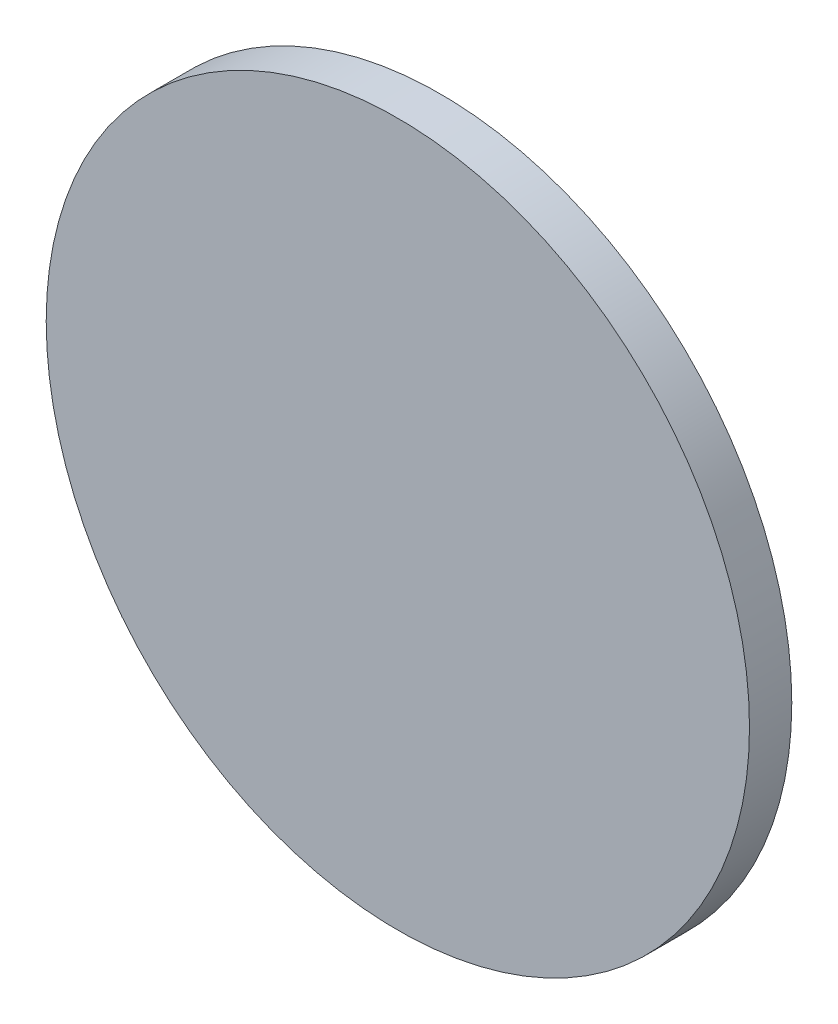
ISO-10303-21;
HEADER;
FILE_DESCRIPTION(('STEP AP214'),'2;1');
FILE_NAME('part.step','',(''),(''),'','','');
FILE_SCHEMA(('AUTOMOTIVE_DESIGN { 1 0 10303 214 1 1 1 1 }'));
ENDSEC;
DATA;
#1=APPLICATION_CONTEXT('core data for automotive mechanical design processes');
#2=APPLICATION_PROTOCOL_DEFINITION('international standard','automotive_design',2000,#1);
#3=PRODUCT_CONTEXT('',#1,'mechanical');
#4=PRODUCT('Part','Part','',(#3));
#5=PRODUCT_RELATED_PRODUCT_CATEGORY('part','',(#4));
#6=PRODUCT_DEFINITION_FORMATION('','',#4);
#7=PRODUCT_DEFINITION_CONTEXT('part definition',#1,'design');
#8=PRODUCT_DEFINITION('design','',#6,#7);
#9=PRODUCT_DEFINITION_SHAPE('','',#8);
#10=(LENGTH_UNIT() NAMED_UNIT(*) SI_UNIT(.MILLI.,.METRE.));
#11=(NAMED_UNIT(*) PLANE_ANGLE_UNIT() SI_UNIT($,.RADIAN.));
#12=(NAMED_UNIT(*) SI_UNIT($,.STERADIAN.) SOLID_ANGLE_UNIT());
#13=UNCERTAINTY_MEASURE_WITH_UNIT(LENGTH_MEASURE(1.E-05),#10,'distance_accuracy_value','');
#14=(GEOMETRIC_REPRESENTATION_CONTEXT(3) GLOBAL_UNCERTAINTY_ASSIGNED_CONTEXT((#13)) GLOBAL_UNIT_ASSIGNED_CONTEXT((#10,
#11,#12)) REPRESENTATION_CONTEXT('',''));
#15=CARTESIAN_POINT('',(0.,0.,0.));
#16=DIRECTION('',(0.,0.,1.));
#17=DIRECTION('',(1.,0.,0.));
#18=AXIS2_PLACEMENT_3D('',#15,#16,#17);
#19=CARTESIAN_POINT('',(-0.364847958219304,-188.000481982774,3.));
#20=DIRECTION('',(0.,0.,-1.));
#21=DIRECTION('',(-1.,0.,0.));
#22=AXIS2_PLACEMENT_3D('',#19,#20,#21);
#23=CYLINDRICAL_SURFACE('',#22,24.9346170997032);
#24=CARTESIAN_POINT('',(-0.364847958219304,-188.000481982774,3.));
#25=DIRECTION('',(0.,0.,1.));
#26=DIRECTION('',(1.,0.,0.));
#27=AXIS2_PLACEMENT_3D('',#24,#25,#26);
#28=CIRCLE('',#27,24.9346170997032);
#29=CARTESIAN_POINT('',(24.5697691414839,-188.000481982774,3.));
#30=VERTEX_POINT('',#29);
#31=EDGE_CURVE('E10',#30,#30,#28,.T.);
#32=ORIENTED_EDGE('',*,*,#31,.F.);
#33=EDGE_LOOP('',(#32));
#34=FACE_BOUND('',#33,.T.);
#35=CARTESIAN_POINT('',(-0.364847958219304,-188.000481982774,0.));
#36=DIRECTION('',(0.,0.,1.));
#37=DIRECTION('',(1.,0.,0.));
#38=AXIS2_PLACEMENT_3D('',#35,#36,#37);
#39=CIRCLE('',#38,24.9346170997032);
#40=CARTESIAN_POINT('',(24.5697691414839,-188.000481982774,0.));
#41=VERTEX_POINT('',#40);
#42=EDGE_CURVE('E40',#41,#41,#39,.T.);
#43=ORIENTED_EDGE('',*,*,#42,.T.);
#44=EDGE_LOOP('',(#43));
#45=FACE_BOUND('',#44,.T.);
#46=ADVANCED_FACE('F37',(#34,#45),#23,.T.);
#47=CARTESIAN_POINT('',(-0.364847958219304,-188.000481982774,3.));
#48=DIRECTION('',(0.,0.,1.));
#49=DIRECTION('',(1.,0.,0.));
#50=AXIS2_PLACEMENT_3D('',#47,#48,#49);
#51=PLANE('',#50);
#52=ORIENTED_EDGE('',*,*,#31,.T.);
#53=EDGE_LOOP('',(#52));
#54=FACE_BOUND('',#53,.T.);
#55=ADVANCED_FACE('F52',(#54),#51,.T.);
#56=CARTESIAN_POINT('',(-0.364847958219304,-188.000481982774,0.));
#57=DIRECTION('',(0.,0.,1.));
#58=DIRECTION('',(1.,0.,0.));
#59=AXIS2_PLACEMENT_3D('',#56,#57,#58);
#60=PLANE('',#59);
#61=ORIENTED_EDGE('',*,*,#42,.F.);
#62=EDGE_LOOP('',(#61));
#63=FACE_BOUND('',#62,.T.);
#64=ADVANCED_FACE('F50',(#63),#60,.F.);
#65=CLOSED_SHELL('',(#46,#55,#64));
#66=MANIFOLD_SOLID_BREP('B2',#65);
#67=ADVANCED_BREP_SHAPE_REPRESENTATION('',(#18,#66),#14);
#68=SHAPE_DEFINITION_REPRESENTATION(#9,#67);
ENDSEC;
END-ISO-10303-21;
